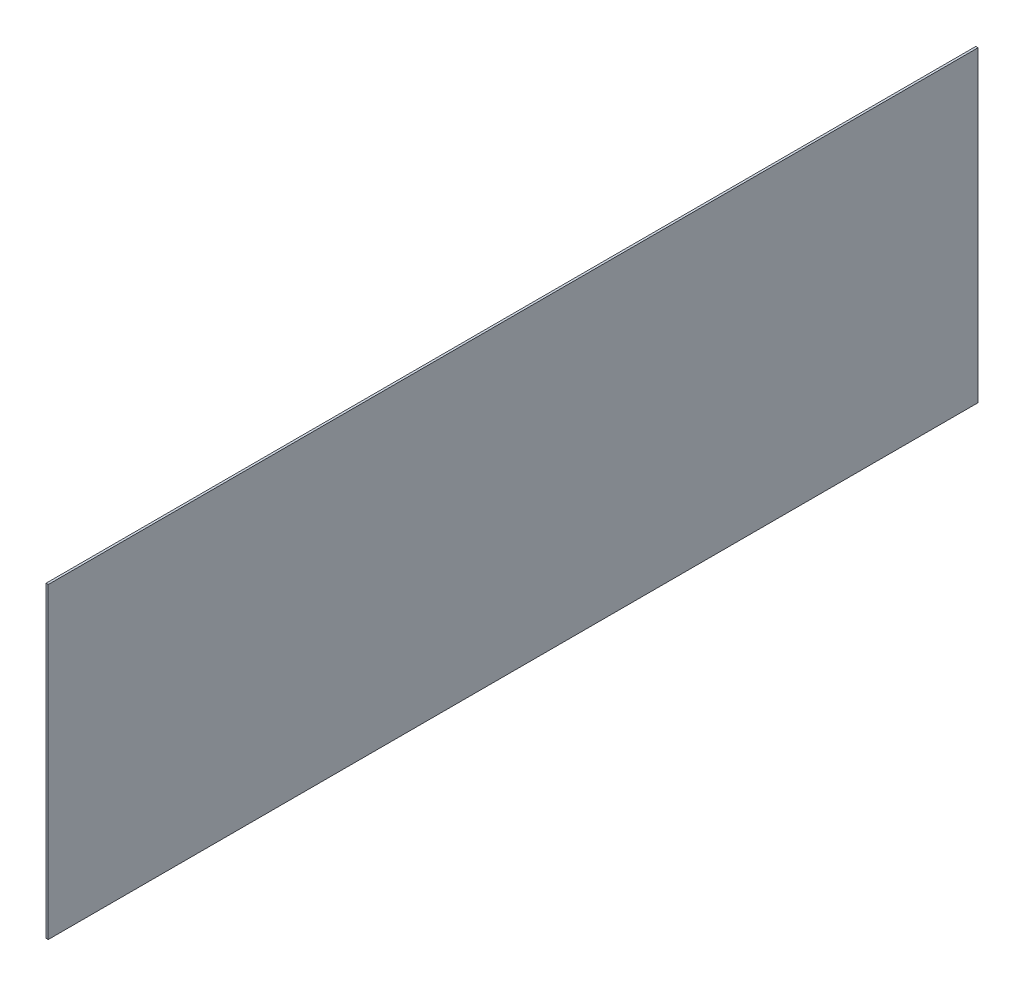
ISO-10303-21;
HEADER;
FILE_DESCRIPTION(('STEP AP214'),'2;1');
FILE_NAME('part.step','',(''),(''),'','','');
FILE_SCHEMA(('AUTOMOTIVE_DESIGN { 1 0 10303 214 1 1 1 1 }'));
ENDSEC;
DATA;
#1=APPLICATION_CONTEXT('core data for automotive mechanical design processes');
#2=APPLICATION_PROTOCOL_DEFINITION('international standard','automotive_design',2000,#1);
#3=PRODUCT_CONTEXT('',#1,'mechanical');
#4=PRODUCT('Part','Part','',(#3));
#5=PRODUCT_RELATED_PRODUCT_CATEGORY('part','',(#4));
#6=PRODUCT_DEFINITION_FORMATION('','',#4);
#7=PRODUCT_DEFINITION_CONTEXT('part definition',#1,'design');
#8=PRODUCT_DEFINITION('design','',#6,#7);
#9=PRODUCT_DEFINITION_SHAPE('','',#8);
#10=(LENGTH_UNIT() NAMED_UNIT(*) SI_UNIT(.MILLI.,.METRE.));
#11=(NAMED_UNIT(*) PLANE_ANGLE_UNIT() SI_UNIT($,.RADIAN.));
#12=(NAMED_UNIT(*) SI_UNIT($,.STERADIAN.) SOLID_ANGLE_UNIT());
#13=UNCERTAINTY_MEASURE_WITH_UNIT(LENGTH_MEASURE(1.E-05),#10,'distance_accuracy_value','');
#14=(GEOMETRIC_REPRESENTATION_CONTEXT(3) GLOBAL_UNCERTAINTY_ASSIGNED_CONTEXT((#13)) GLOBAL_UNIT_ASSIGNED_CONTEXT((#10,
#11,#12)) REPRESENTATION_CONTEXT('',''));
#15=CARTESIAN_POINT('',(0.,0.,0.));
#16=DIRECTION('',(0.,0.,1.));
#17=DIRECTION('',(1.,0.,0.));
#18=AXIS2_PLACEMENT_3D('',#15,#16,#17);
#19=CARTESIAN_POINT('',(1.,0.,0.));
#20=DIRECTION('',(0.,0.,1.));
#21=DIRECTION('',(1.,0.,0.));
#22=AXIS2_PLACEMENT_3D('',#19,#20,#21);
#23=PLANE('',#22);
#24=DIRECTION('',(0.,1.,0.));
#25=VECTOR('',#24,1.);
#26=CARTESIAN_POINT('',(0.,0.,0.));
#27=LINE('',#26,#25);
#28=CARTESIAN_POINT('',(0.,0.,0.));
#29=VERTEX_POINT('',#28);
#30=CARTESIAN_POINT('',(0.,137.123665554,0.));
#31=VERTEX_POINT('',#30);
#32=EDGE_CURVE('E101',#29,#31,#27,.T.);
#33=ORIENTED_EDGE('',*,*,#32,.F.);
#34=DIRECTION('',(-1.,0.,0.));
#35=VECTOR('',#34,1.);
#36=CARTESIAN_POINT('',(1.,0.,0.));
#37=LINE('',#36,#35);
#38=CARTESIAN_POINT('',(1.,0.,0.));
#39=VERTEX_POINT('',#38);
#40=EDGE_CURVE('E11',#39,#29,#37,.T.);
#41=ORIENTED_EDGE('',*,*,#40,.F.);
#42=DIRECTION('',(0.,1.,0.));
#43=VECTOR('',#42,1.);
#44=CARTESIAN_POINT('',(1.,0.,0.));
#45=LINE('',#44,#43);
#46=CARTESIAN_POINT('',(1.,137.123665554,0.));
#47=VERTEX_POINT('',#46);
#48=EDGE_CURVE('E96',#39,#47,#45,.T.);
#49=ORIENTED_EDGE('',*,*,#48,.T.);
#50=DIRECTION('',(-1.,0.,0.));
#51=VECTOR('',#50,1.);
#52=CARTESIAN_POINT('',(1.,137.123665554,0.));
#53=LINE('',#52,#51);
#54=EDGE_CURVE('E39',#47,#31,#53,.T.);
#55=ORIENTED_EDGE('',*,*,#54,.T.);
#56=EDGE_LOOP('',(#33,#41,#49,#55));
#57=FACE_BOUND('',#56,.T.);
#58=ADVANCED_FACE('F36',(#57),#23,.T.);
#59=CARTESIAN_POINT('',(1.,0.,0.));
#60=DIRECTION('',(0.,1.,0.));
#61=DIRECTION('',(0.,0.,1.));
#62=AXIS2_PLACEMENT_3D('',#59,#60,#61);
#63=PLANE('',#62);
#64=DIRECTION('',(0.,0.,-1.));
#65=VECTOR('',#64,1.);
#66=CARTESIAN_POINT('',(0.,0.,0.));
#67=LINE('',#66,#65);
#68=CARTESIAN_POINT('',(0.,0.,-414.644000022));
#69=VERTEX_POINT('',#68);
#70=EDGE_CURVE('E69',#29,#69,#67,.T.);
#71=ORIENTED_EDGE('',*,*,#70,.T.);
#72=DIRECTION('',(-1.,0.,0.));
#73=VECTOR('',#72,1.);
#74=CARTESIAN_POINT('',(1.,0.,-414.644000022));
#75=LINE('',#74,#73);
#76=CARTESIAN_POINT('',(1.,0.,-414.644000022));
#77=VERTEX_POINT('',#76);
#78=EDGE_CURVE('E45',#77,#69,#75,.T.);
#79=ORIENTED_EDGE('',*,*,#78,.F.);
#80=DIRECTION('',(0.,0.,-1.));
#81=VECTOR('',#80,1.);
#82=CARTESIAN_POINT('',(1.,0.,0.));
#83=LINE('',#82,#81);
#84=EDGE_CURVE('E86',#39,#77,#83,.T.);
#85=ORIENTED_EDGE('',*,*,#84,.F.);
#86=ORIENTED_EDGE('',*,*,#40,.T.);
#87=EDGE_LOOP('',(#71,#79,#85,#86));
#88=FACE_BOUND('',#87,.T.);
#89=ADVANCED_FACE('F111',(#88),#63,.F.);
#90=CARTESIAN_POINT('',(1.,0.,-414.644000022));
#91=DIRECTION('',(0.,0.,1.));
#92=DIRECTION('',(1.,0.,0.));
#93=AXIS2_PLACEMENT_3D('',#90,#91,#92);
#94=PLANE('',#93);
#95=DIRECTION('',(0.,1.,0.));
#96=VECTOR('',#95,1.);
#97=CARTESIAN_POINT('',(0.,0.,-414.644000022));
#98=LINE('',#97,#96);
#99=CARTESIAN_POINT('',(0.,137.123665554,-414.644000022));
#100=VERTEX_POINT('',#99);
#101=EDGE_CURVE('E93',#69,#100,#98,.T.);
#102=ORIENTED_EDGE('',*,*,#101,.T.);
#103=DIRECTION('',(-1.,0.,0.));
#104=VECTOR('',#103,1.);
#105=CARTESIAN_POINT('',(1.,137.123665554,-414.644000022));
#106=LINE('',#105,#104);
#107=CARTESIAN_POINT('',(1.,137.123665554,-414.644000022));
#108=VERTEX_POINT('',#107);
#109=EDGE_CURVE('E90',#108,#100,#106,.T.);
#110=ORIENTED_EDGE('',*,*,#109,.F.);
#111=DIRECTION('',(0.,1.,0.));
#112=VECTOR('',#111,1.);
#113=CARTESIAN_POINT('',(1.,0.,-414.644000022));
#114=LINE('',#113,#112);
#115=EDGE_CURVE('E81',#77,#108,#114,.T.);
#116=ORIENTED_EDGE('',*,*,#115,.F.);
#117=ORIENTED_EDGE('',*,*,#78,.T.);
#118=EDGE_LOOP('',(#102,#110,#116,#117));
#119=FACE_BOUND('',#118,.T.);
#120=ADVANCED_FACE('F91',(#119),#94,.F.);
#121=CARTESIAN_POINT('',(1.,137.123665554,0.));
#122=DIRECTION('',(0.,1.,0.));
#123=DIRECTION('',(0.,0.,1.));
#124=AXIS2_PLACEMENT_3D('',#121,#122,#123);
#125=PLANE('',#124);
#126=DIRECTION('',(0.,0.,-1.));
#127=VECTOR('',#126,1.);
#128=CARTESIAN_POINT('',(0.,137.123665554,0.));
#129=LINE('',#128,#127);
#130=EDGE_CURVE('E104',#31,#100,#129,.T.);
#131=ORIENTED_EDGE('',*,*,#130,.F.);
#132=ORIENTED_EDGE('',*,*,#54,.F.);
#133=DIRECTION('',(0.,0.,-1.));
#134=VECTOR('',#133,1.);
#135=CARTESIAN_POINT('',(1.,137.123665554,0.));
#136=LINE('',#135,#134);
#137=EDGE_CURVE('E85',#47,#108,#136,.T.);
#138=ORIENTED_EDGE('',*,*,#137,.T.);
#139=ORIENTED_EDGE('',*,*,#109,.T.);
#140=EDGE_LOOP('',(#131,#132,#138,#139));
#141=FACE_BOUND('',#140,.T.);
#142=ADVANCED_FACE('F95',(#141),#125,.T.);
#143=CARTESIAN_POINT('',(1.,0.,0.));
#144=DIRECTION('',(-1.,0.,0.));
#145=DIRECTION('',(0.,0.,1.));
#146=AXIS2_PLACEMENT_3D('',#143,#144,#145);
#147=PLANE('',#146);
#148=ORIENTED_EDGE('',*,*,#48,.F.);
#149=ORIENTED_EDGE('',*,*,#84,.T.);
#150=ORIENTED_EDGE('',*,*,#115,.T.);
#151=ORIENTED_EDGE('',*,*,#137,.F.);
#152=EDGE_LOOP('',(#148,#149,#150,#151));
#153=FACE_BOUND('',#152,.T.);
#154=ADVANCED_FACE('F84',(#153),#147,.F.);
#155=CARTESIAN_POINT('',(0.,0.,0.));
#156=DIRECTION('',(-1.,0.,0.));
#157=DIRECTION('',(0.,0.,1.));
#158=AXIS2_PLACEMENT_3D('',#155,#156,#157);
#159=PLANE('',#158);
#160=ORIENTED_EDGE('',*,*,#32,.T.);
#161=ORIENTED_EDGE('',*,*,#130,.T.);
#162=ORIENTED_EDGE('',*,*,#101,.F.);
#163=ORIENTED_EDGE('',*,*,#70,.F.);
#164=EDGE_LOOP('',(#160,#161,#162,#163));
#165=FACE_BOUND('',#164,.T.);
#166=ADVANCED_FACE('F109',(#165),#159,.T.);
#167=CLOSED_SHELL('',(#58,#89,#120,#142,#154,#166));
#168=MANIFOLD_SOLID_BREP('B2',#167);
#169=ADVANCED_BREP_SHAPE_REPRESENTATION('',(#18,#168),#14);
#170=SHAPE_DEFINITION_REPRESENTATION(#9,#169);
ENDSEC;
END-ISO-10303-21;
